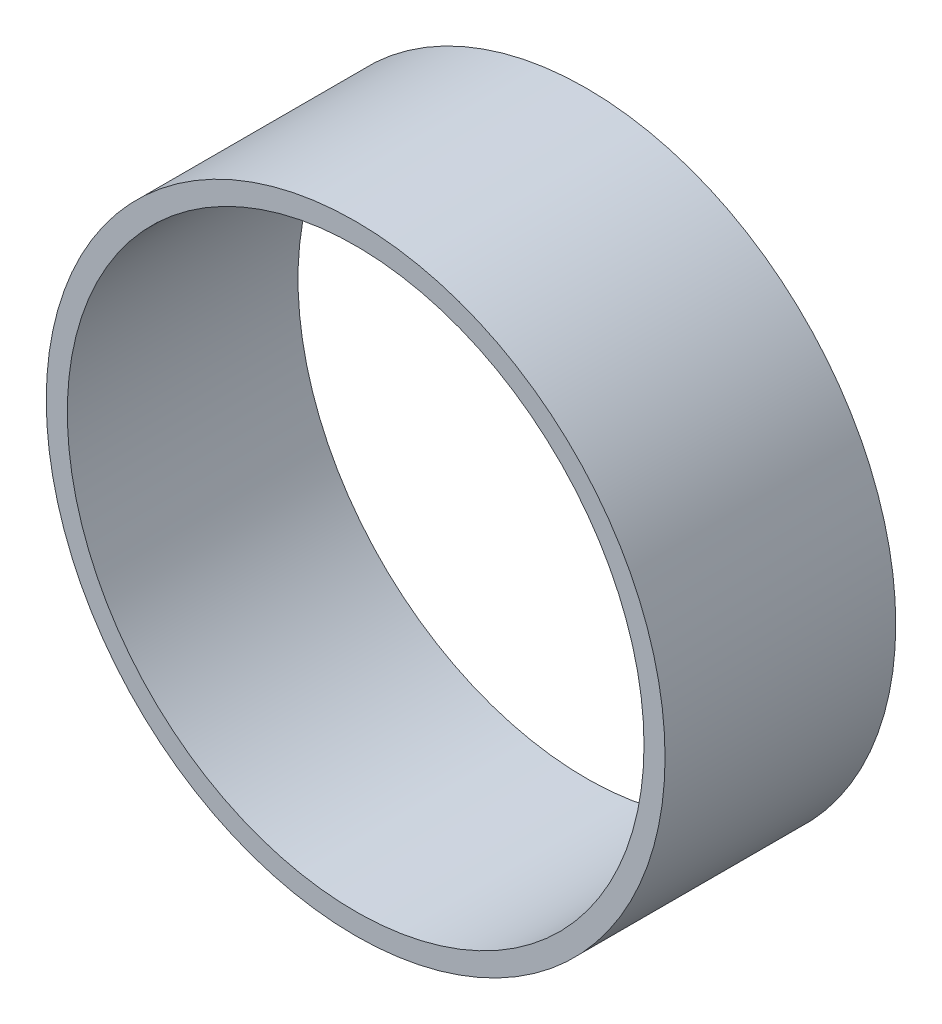
ISO-10303-21;
HEADER;
FILE_DESCRIPTION(('STEP AP214'),'2;1');
FILE_NAME('part.step','',(''),(''),'','','');
FILE_SCHEMA(('AUTOMOTIVE_DESIGN { 1 0 10303 214 1 1 1 1 }'));
ENDSEC;
DATA;
#1=APPLICATION_CONTEXT('core data for automotive mechanical design processes');
#2=APPLICATION_PROTOCOL_DEFINITION('international standard','automotive_design',2000,#1);
#3=PRODUCT_CONTEXT('',#1,'mechanical');
#4=PRODUCT('Part','Part','',(#3));
#5=PRODUCT_RELATED_PRODUCT_CATEGORY('part','',(#4));
#6=PRODUCT_DEFINITION_FORMATION('','',#4);
#7=PRODUCT_DEFINITION_CONTEXT('part definition',#1,'design');
#8=PRODUCT_DEFINITION('design','',#6,#7);
#9=PRODUCT_DEFINITION_SHAPE('','',#8);
#10=(LENGTH_UNIT() NAMED_UNIT(*) SI_UNIT(.MILLI.,.METRE.));
#11=(NAMED_UNIT(*) PLANE_ANGLE_UNIT() SI_UNIT($,.RADIAN.));
#12=(NAMED_UNIT(*) SI_UNIT($,.STERADIAN.) SOLID_ANGLE_UNIT());
#13=UNCERTAINTY_MEASURE_WITH_UNIT(LENGTH_MEASURE(1.E-05),#10,'distance_accuracy_value','');
#14=(GEOMETRIC_REPRESENTATION_CONTEXT(3) GLOBAL_UNCERTAINTY_ASSIGNED_CONTEXT((#13)) GLOBAL_UNIT_ASSIGNED_CONTEXT((#10,
#11,#12)) REPRESENTATION_CONTEXT('',''));
#15=CARTESIAN_POINT('',(0.,0.,0.));
#16=DIRECTION('',(0.,0.,1.));
#17=DIRECTION('',(1.,0.,0.));
#18=AXIS2_PLACEMENT_3D('',#15,#16,#17);
#19=CARTESIAN_POINT('',(0.,0.,101.6));
#20=DIRECTION('',(0.,0.,1.));
#21=DIRECTION('',(1.,0.,0.));
#22=AXIS2_PLACEMENT_3D('',#19,#20,#21);
#23=PLANE('',#22);
#24=CARTESIAN_POINT('',(0.,0.,101.6));
#25=DIRECTION('',(0.,0.,1.));
#26=DIRECTION('',(1.,0.,0.));
#27=AXIS2_PLACEMENT_3D('',#24,#25,#26);
#28=CIRCLE('',#27,136.271);
#29=CARTESIAN_POINT('',(136.271,0.,101.6));
#30=VERTEX_POINT('',#29);
#31=EDGE_CURVE('E10',#30,#30,#28,.T.);
#32=ORIENTED_EDGE('',*,*,#31,.T.);
#33=EDGE_LOOP('',(#32));
#34=FACE_BOUND('',#33,.T.);
#35=CARTESIAN_POINT('',(0.,0.,101.6));
#36=DIRECTION('',(0.,0.,1.));
#37=DIRECTION('',(1.,0.,0.));
#38=AXIS2_PLACEMENT_3D('',#35,#36,#37);
#39=CIRCLE('',#38,127.);
#40=CARTESIAN_POINT('',(127.,0.,101.6));
#41=VERTEX_POINT('',#40);
#42=EDGE_CURVE('E50',#41,#41,#39,.T.);
#43=ORIENTED_EDGE('',*,*,#42,.F.);
#44=EDGE_LOOP('',(#43));
#45=FACE_BOUND('',#44,.T.);
#46=ADVANCED_FACE('F37',(#34,#45),#23,.T.);
#47=CARTESIAN_POINT('',(0.,0.,0.));
#48=DIRECTION('',(0.,0.,1.));
#49=DIRECTION('',(1.,0.,0.));
#50=AXIS2_PLACEMENT_3D('',#47,#48,#49);
#51=PLANE('',#50);
#52=CARTESIAN_POINT('',(0.,0.,0.));
#53=DIRECTION('',(0.,0.,1.));
#54=DIRECTION('',(1.,0.,0.));
#55=AXIS2_PLACEMENT_3D('',#52,#53,#54);
#56=CIRCLE('',#55,136.271);
#57=CARTESIAN_POINT('',(136.271,0.,0.));
#58=VERTEX_POINT('',#57);
#59=EDGE_CURVE('E41',#58,#58,#56,.T.);
#60=ORIENTED_EDGE('',*,*,#59,.F.);
#61=EDGE_LOOP('',(#60));
#62=FACE_BOUND('',#61,.T.);
#63=CARTESIAN_POINT('',(0.,0.,0.));
#64=DIRECTION('',(0.,0.,1.));
#65=DIRECTION('',(1.,0.,0.));
#66=AXIS2_PLACEMENT_3D('',#63,#64,#65);
#67=CIRCLE('',#66,127.);
#68=CARTESIAN_POINT('',(127.,0.,0.));
#69=VERTEX_POINT('',#68);
#70=EDGE_CURVE('E52',#69,#69,#67,.T.);
#71=ORIENTED_EDGE('',*,*,#70,.T.);
#72=EDGE_LOOP('',(#71));
#73=FACE_BOUND('',#72,.T.);
#74=ADVANCED_FACE('F64',(#62,#73),#51,.F.);
#75=CARTESIAN_POINT('',(0.,0.,101.6));
#76=DIRECTION('',(0.,0.,-1.));
#77=DIRECTION('',(-1.,0.,0.));
#78=AXIS2_PLACEMENT_3D('',#75,#76,#77);
#79=CYLINDRICAL_SURFACE('',#78,136.271);
#80=ORIENTED_EDGE('',*,*,#31,.F.);
#81=EDGE_LOOP('',(#80));
#82=FACE_BOUND('',#81,.T.);
#83=ORIENTED_EDGE('',*,*,#59,.T.);
#84=EDGE_LOOP('',(#83));
#85=FACE_BOUND('',#84,.T.);
#86=ADVANCED_FACE('F39',(#82,#85),#79,.T.);
#87=CARTESIAN_POINT('',(0.,0.,101.6));
#88=DIRECTION('',(0.,0.,-1.));
#89=DIRECTION('',(-1.,0.,0.));
#90=AXIS2_PLACEMENT_3D('',#87,#88,#89);
#91=CYLINDRICAL_SURFACE('',#90,127.);
#92=ORIENTED_EDGE('',*,*,#42,.T.);
#93=EDGE_LOOP('',(#92));
#94=FACE_BOUND('',#93,.T.);
#95=ORIENTED_EDGE('',*,*,#70,.F.);
#96=EDGE_LOOP('',(#95));
#97=FACE_BOUND('',#96,.T.);
#98=ADVANCED_FACE('F60',(#94,#97),#91,.F.);
#99=CLOSED_SHELL('',(#46,#74,#86,#98));
#100=MANIFOLD_SOLID_BREP('B2',#99);
#101=ADVANCED_BREP_SHAPE_REPRESENTATION('',(#18,#100),#14);
#102=SHAPE_DEFINITION_REPRESENTATION(#9,#101);
ENDSEC;
END-ISO-10303-21;
